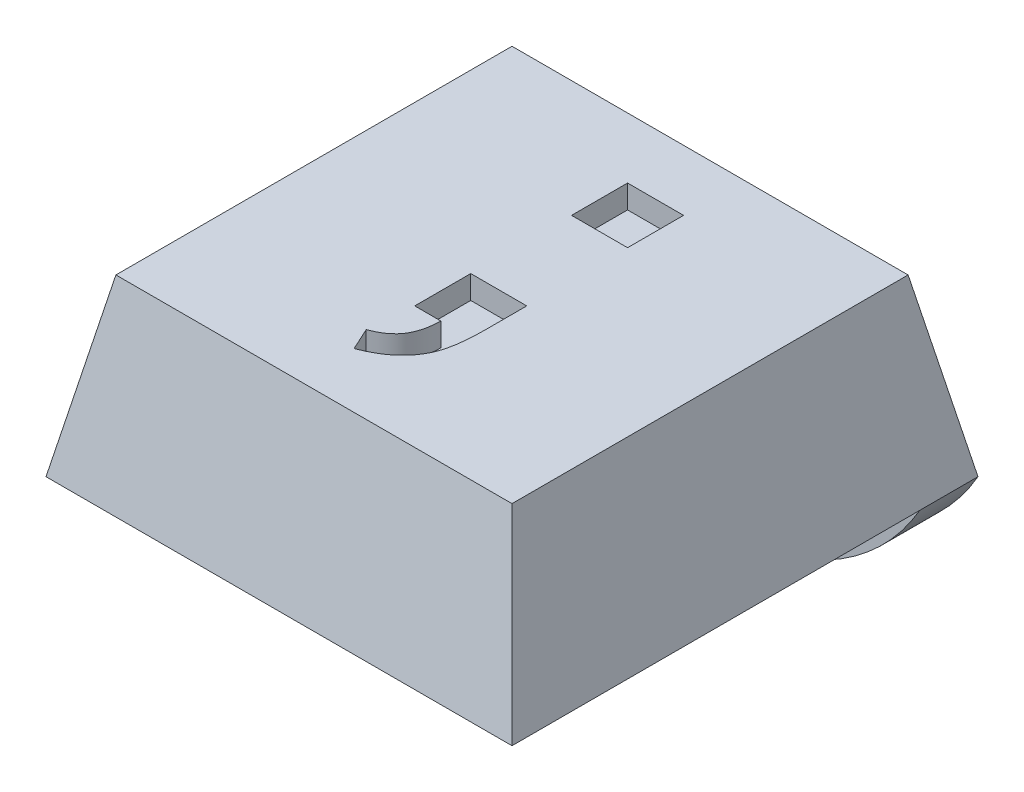
ISO-10303-21;
HEADER;
FILE_DESCRIPTION(('STEP AP214'),'2;1');
FILE_NAME('part.step','',(''),(''),'','','');
FILE_SCHEMA(('AUTOMOTIVE_DESIGN { 1 0 10303 214 1 1 1 1 }'));
ENDSEC;
DATA;
#1=APPLICATION_CONTEXT('core data for automotive mechanical design processes');
#2=APPLICATION_PROTOCOL_DEFINITION('international standard','automotive_design',2000,#1);
#3=PRODUCT_CONTEXT('',#1,'mechanical');
#4=PRODUCT('Part','Part','',(#3));
#5=PRODUCT_RELATED_PRODUCT_CATEGORY('part','',(#4));
#6=PRODUCT_DEFINITION_FORMATION('','',#4);
#7=PRODUCT_DEFINITION_CONTEXT('part definition',#1,'design');
#8=PRODUCT_DEFINITION('design','',#6,#7);
#9=PRODUCT_DEFINITION_SHAPE('','',#8);
#10=(LENGTH_UNIT() NAMED_UNIT(*) SI_UNIT(.MILLI.,.METRE.));
#11=(NAMED_UNIT(*) PLANE_ANGLE_UNIT() SI_UNIT($,.RADIAN.));
#12=(NAMED_UNIT(*) SI_UNIT($,.STERADIAN.) SOLID_ANGLE_UNIT());
#13=UNCERTAINTY_MEASURE_WITH_UNIT(LENGTH_MEASURE(1.E-05),#10,'distance_accuracy_value','');
#14=(GEOMETRIC_REPRESENTATION_CONTEXT(3) GLOBAL_UNCERTAINTY_ASSIGNED_CONTEXT((#13)) GLOBAL_UNIT_ASSIGNED_CONTEXT((#10,
#11,#12)) REPRESENTATION_CONTEXT('',''));
#15=CARTESIAN_POINT('',(0.,0.,0.));
#16=DIRECTION('',(0.,0.,1.));
#17=DIRECTION('',(1.,0.,0.));
#18=AXIS2_PLACEMENT_3D('',#15,#16,#17);
#19=CARTESIAN_POINT('',(0.,3.,0.));
#20=DIRECTION('',(0.,-1.,0.));
#21=DIRECTION('',(0.,0.,-1.));
#22=AXIS2_PLACEMENT_3D('',#19,#20,#21);
#23=PLANE('',#22);
#24=DIRECTION('',(0.,0.,-1.));
#25=VECTOR('',#24,1.);
#26=CARTESIAN_POINT('',(3.62560596272532,3.,-2.70454580911656));
#27=LINE('',#26,#25);
#28=CARTESIAN_POINT('',(3.62560596272532,3.,-2.70454580911656));
#29=VERTEX_POINT('',#28);
#30=CARTESIAN_POINT('',(3.62560596272532,3.,-3.66608427065502));
#31=VERTEX_POINT('',#30);
#32=EDGE_CURVE('E66',#29,#31,#27,.T.);
#33=ORIENTED_EDGE('',*,*,#32,.T.);
#34=DIRECTION('',(1.,0.,0.));
#35=VECTOR('',#34,1.);
#36=CARTESIAN_POINT('',(3.62560596272532,3.,-3.66608427065502));
#37=LINE('',#36,#35);
#38=CARTESIAN_POINT('',(4.58714442426378,3.,-3.66608427065502));
#39=VERTEX_POINT('',#38);
#40=EDGE_CURVE('E257',#31,#39,#37,.T.);
#41=ORIENTED_EDGE('',*,*,#40,.T.);
#42=DIRECTION('',(0.,0.,1.));
#43=VECTOR('',#42,1.);
#44=CARTESIAN_POINT('',(4.58714442426378,3.,-3.66608427065502));
#45=LINE('',#44,#43);
#46=CARTESIAN_POINT('',(4.58714442426378,3.,-2.96696568091143));
#47=VERTEX_POINT('',#46);
#48=EDGE_CURVE('E250',#39,#47,#45,.T.);
#49=ORIENTED_EDGE('',*,*,#48,.T.);
#50=CARTESIAN_POINT('',(4.58714442426378,3.,-2.96696568091143));
#51=CARTESIAN_POINT('',(4.58670080188822,3.,-2.8998214545401));
#52=CARTESIAN_POINT('',(4.58586318464706,3.,-2.773044346911));
#53=CARTESIAN_POINT('',(4.5711807141441,3.,-2.59420782113115));
#54=CARTESIAN_POINT('',(4.55077955569935,3.,-2.43715871833273));
#55=CARTESIAN_POINT('',(4.51832434165699,3.,-2.29987836082914));
#56=CARTESIAN_POINT('',(4.47486996985113,3.,-2.17590282720244));
#57=CARTESIAN_POINT('',(4.41343250196285,3.,-2.0624610132431));
#58=CARTESIAN_POINT('',(4.33787617270612,3.,-1.95390116465176));
#59=CARTESIAN_POINT('',(4.24545832633569,3.,-1.85350819015156));
#60=CARTESIAN_POINT('',(4.13914433473163,3.,-1.76065477060563));
#61=CARTESIAN_POINT('',(4.01770228425887,3.,-1.67990868813372));
#62=CARTESIAN_POINT('',(3.8840141798944,3.,-1.60796791501552));
#63=CARTESIAN_POINT('',(3.78796965576735,3.,-1.57009411793428));
#64=CARTESIAN_POINT('',(3.73878705246891,3.,-1.5506996552704));
#65=B_SPLINE_CURVE_WITH_KNOTS('',3,(#50,#51,#52,#53,#54,#55,#56,#57,#58,#59,#60,#61,#62,#63,
#64),.UNSPECIFIED.,.F.,.F.,(4,1,1,1,1,1,1,1,1,1,1,1,4),(0.,0.11226306929848,0.211967401940366,
0.29994169044828,0.376872974033872,0.447529216959618,0.518973247744178,0.591939579442453,
0.668229800220916,0.746606683184937,0.827453118097728,0.911641971053369,1.),.UNSPECIFIED.);
#66=CARTESIAN_POINT('',(3.73878705246891,3.,-1.5506996552704));
#67=VERTEX_POINT('',#66);
#68=EDGE_CURVE('E244',#47,#67,#65,.T.);
#69=ORIENTED_EDGE('',*,*,#68,.T.);
#70=DIRECTION('',(-0.418608195745655,0.,-0.908166933143113));
#71=VECTOR('',#70,1.);
#72=CARTESIAN_POINT('',(3.73878705246891,3.,-1.5506996552704));
#73=LINE('',#72,#71);
#74=CARTESIAN_POINT('',(3.56150339862276,3.,-1.93531503988579));
#75=VERTEX_POINT('',#74);
#76=EDGE_CURVE('E237',#67,#75,#73,.T.);
#77=ORIENTED_EDGE('',*,*,#76,.T.);
#78=CARTESIAN_POINT('',(3.56150339862276,3.,-1.93531503988579));
#79=CARTESIAN_POINT('',(3.60443904727415,3.,-1.95287327859119));
#80=CARTESIAN_POINT('',(3.68652767187352,3.,-1.98644285797304));
#81=CARTESIAN_POINT('',(3.79593869083479,3.,-2.05254331387848));
#82=CARTESIAN_POINT('',(3.88510542084114,3.,-2.12979243913342));
#83=CARTESIAN_POINT('',(3.95578080095513,3.,-2.21816567640612));
#84=CARTESIAN_POINT('',(4.00665680397726,3.,-2.32038588001785));
#85=CARTESIAN_POINT('',(4.0454560874376,3.,-2.4351046568917));
#86=CARTESIAN_POINT('',(4.06746970030978,3.,-2.56519407020958));
#87=CARTESIAN_POINT('',(4.07197181972445,3.,-2.65672585366105));
#88=CARTESIAN_POINT('',(4.07432391144327,3.,-2.70454580911656));
#89=B_SPLINE_CURVE_WITH_KNOTS('',3,(#78,#79,#80,#81,#82,#83,#84,#85,#86,#87,#88),.UNSPECIFIED.,
.F.,.F.,(4,1,1,1,1,1,1,1,4),(0.,0.139427091721974,0.266570520088693,0.382614322525073,
0.49274666985973,0.604615352902253,0.724373630152636,0.856001486790094,1.),.UNSPECIFIED.);
#90=CARTESIAN_POINT('',(4.07432391144327,3.,-2.70454580911656));
#91=VERTEX_POINT('',#90);
#92=EDGE_CURVE('E230',#75,#91,#89,.T.);
#93=ORIENTED_EDGE('',*,*,#92,.T.);
#94=DIRECTION('',(-1.,0.,0.));
#95=VECTOR('',#94,1.);
#96=CARTESIAN_POINT('',(4.07432391144327,3.,-2.70454580911656));
#97=LINE('',#96,#95);
#98=EDGE_CURVE('E226',#91,#29,#97,.T.);
#99=ORIENTED_EDGE('',*,*,#98,.T.);
#100=EDGE_LOOP('',(#33,#41,#49,#69,#77,#93,#99));
#101=FACE_BOUND('',#100,.T.);
#102=DIRECTION('',(-1.,0.,0.));
#103=VECTOR('',#102,1.);
#104=CARTESIAN_POINT('',(11.,3.,-0.6));
#105=LINE('',#104,#103);
#106=CARTESIAN_POINT('',(7.4,3.,-0.6));
#107=VERTEX_POINT('',#106);
#108=CARTESIAN_POINT('',(0.6,3.,-0.6));
#109=VERTEX_POINT('',#108);
#110=EDGE_CURVE('E377',#107,#109,#105,.T.);
#111=ORIENTED_EDGE('',*,*,#110,.F.);
#112=DIRECTION('',(0.,0.,1.));
#113=VECTOR('',#112,1.);
#114=CARTESIAN_POINT('',(7.4,3.,-8.));
#115=LINE('',#114,#113);
#116=CARTESIAN_POINT('',(7.4,3.,-7.4));
#117=VERTEX_POINT('',#116);
#118=EDGE_CURVE('E390',#117,#107,#115,.T.);
#119=ORIENTED_EDGE('',*,*,#118,.F.);
#120=DIRECTION('',(-1.,0.,0.));
#121=VECTOR('',#120,1.);
#122=CARTESIAN_POINT('',(11.,3.,-7.4));
#123=LINE('',#122,#121);
#124=CARTESIAN_POINT('',(0.599999999999999,3.,-7.4));
#125=VERTEX_POINT('',#124);
#126=EDGE_CURVE('E373',#117,#125,#123,.T.);
#127=ORIENTED_EDGE('',*,*,#126,.T.);
#128=DIRECTION('',(0.,0.,1.));
#129=VECTOR('',#128,1.);
#130=CARTESIAN_POINT('',(0.6,3.,-8.));
#131=LINE('',#130,#129);
#132=EDGE_CURVE('E393',#125,#109,#131,.T.);
#133=ORIENTED_EDGE('',*,*,#132,.T.);
#134=EDGE_LOOP('',(#111,#119,#127,#133));
#135=FACE_BOUND('',#134,.T.);
#136=DIRECTION('',(-1.,0.,0.));
#137=VECTOR('',#136,1.);
#138=CARTESIAN_POINT('',(4.58714442426378,3.,-5.39685350142425));
#139=LINE('',#138,#137);
#140=CARTESIAN_POINT('',(4.58714442426378,3.,-5.39685350142425));
#141=VERTEX_POINT('',#140);
#142=CARTESIAN_POINT('',(3.62560596272532,3.,-5.39685350142425));
#143=VERTEX_POINT('',#142);
#144=EDGE_CURVE('E58',#141,#143,#139,.T.);
#145=ORIENTED_EDGE('',*,*,#144,.T.);
#146=DIRECTION('',(0.,0.,-1.));
#147=VECTOR('',#146,1.);
#148=CARTESIAN_POINT('',(3.62560596272532,3.,-5.39685350142425));
#149=LINE('',#148,#147);
#150=CARTESIAN_POINT('',(3.62560596272532,3.,-6.35839196296271));
#151=VERTEX_POINT('',#150);
#152=EDGE_CURVE('E190',#143,#151,#149,.T.);
#153=ORIENTED_EDGE('',*,*,#152,.T.);
#154=DIRECTION('',(1.,0.,0.));
#155=VECTOR('',#154,1.);
#156=CARTESIAN_POINT('',(3.62560596272532,3.,-6.35839196296271));
#157=LINE('',#156,#155);
#158=CARTESIAN_POINT('',(4.58714442426378,3.,-6.35839196296271));
#159=VERTEX_POINT('',#158);
#160=EDGE_CURVE('E462',#151,#159,#157,.T.);
#161=ORIENTED_EDGE('',*,*,#160,.T.);
#162=DIRECTION('',(0.,0.,1.));
#163=VECTOR('',#162,1.);
#164=CARTESIAN_POINT('',(4.58714442426378,3.,-6.35839196296271));
#165=LINE('',#164,#163);
#166=EDGE_CURVE('E186',#159,#141,#165,.T.);
#167=ORIENTED_EDGE('',*,*,#166,.T.);
#168=EDGE_LOOP('',(#145,#153,#161,#167));
#169=FACE_BOUND('',#168,.T.);
#170=ADVANCED_FACE('F42',(#101,#135,#169),#23,.F.);
#171=CARTESIAN_POINT('',(8.,0.,-8.));
#172=DIRECTION('',(-0.98058067569092,-0.196116135138184,0.));
#173=DIRECTION('',(0.196116135138184,-0.98058067569092,0.));
#174=AXIS2_PLACEMENT_3D('',#171,#172,#173);
#175=PLANE('',#174);
#176=DIRECTION('',(-0.192450089729875,0.962250448649376,-0.192450089729875));
#177=VECTOR('',#176,1.);
#178=CARTESIAN_POINT('',(7.7037037037037,1.48148148148148,-0.296296296296296));
#179=LINE('',#178,#177);
#180=CARTESIAN_POINT('',(8.,0.,0.));
#181=VERTEX_POINT('',#180);
#182=EDGE_CURVE('E387',#181,#107,#179,.T.);
#183=ORIENTED_EDGE('',*,*,#182,.F.);
#184=DIRECTION('',(0.,0.,-1.));
#185=VECTOR('',#184,1.);
#186=CARTESIAN_POINT('',(8.,0.,0.));
#187=LINE('',#186,#185);
#188=CARTESIAN_POINT('',(8.,0.,-7.));
#189=VERTEX_POINT('',#188);
#190=EDGE_CURVE('E404',#181,#189,#187,.T.);
#191=ORIENTED_EDGE('',*,*,#190,.T.);
#192=DIRECTION('',(0.,0.,1.));
#193=VECTOR('',#192,1.);
#194=CARTESIAN_POINT('',(8.,0.,-8.));
#195=LINE('',#194,#193);
#196=CARTESIAN_POINT('',(8.,0.,-8.));
#197=VERTEX_POINT('',#196);
#198=EDGE_CURVE('E192',#197,#189,#195,.T.);
#199=ORIENTED_EDGE('',*,*,#198,.F.);
#200=DIRECTION('',(0.192450089729875,-0.962250448649376,-0.192450089729875));
#201=VECTOR('',#200,1.);
#202=CARTESIAN_POINT('',(8.,0.,-8.));
#203=LINE('',#202,#201);
#204=EDGE_CURVE('E380',#117,#197,#203,.T.);
#205=ORIENTED_EDGE('',*,*,#204,.F.);
#206=ORIENTED_EDGE('',*,*,#118,.T.);
#207=EDGE_LOOP('',(#183,#191,#199,#205,#206));
#208=FACE_BOUND('',#207,.T.);
#209=ADVANCED_FACE('F325',(#208),#175,.F.);
#210=CARTESIAN_POINT('',(0.,0.,-8.));
#211=DIRECTION('',(0.98058067569092,-0.196116135138184,0.));
#212=DIRECTION('',(0.196116135138184,0.98058067569092,0.));
#213=AXIS2_PLACEMENT_3D('',#210,#211,#212);
#214=PLANE('',#213);
#215=DIRECTION('',(-0.192450089729875,-0.962250448649376,0.192450089729875));
#216=VECTOR('',#215,1.);
#217=CARTESIAN_POINT('',(0.296296296296296,1.48148148148148,-0.296296296296296));
#218=LINE('',#217,#216);
#219=CARTESIAN_POINT('',(0.,0.,0.));
#220=VERTEX_POINT('',#219);
#221=EDGE_CURVE('E429',#109,#220,#218,.T.);
#222=ORIENTED_EDGE('',*,*,#221,.F.);
#223=ORIENTED_EDGE('',*,*,#132,.F.);
#224=DIRECTION('',(0.192450089729875,0.962250448649376,0.192450089729875));
#225=VECTOR('',#224,1.);
#226=CARTESIAN_POINT('',(0.,0.,-8.));
#227=LINE('',#226,#225);
#228=CARTESIAN_POINT('',(0.,0.,-8.));
#229=VERTEX_POINT('',#228);
#230=EDGE_CURVE('E403',#229,#125,#227,.T.);
#231=ORIENTED_EDGE('',*,*,#230,.F.);
#232=DIRECTION('',(0.,0.,1.));
#233=VECTOR('',#232,1.);
#234=CARTESIAN_POINT('',(0.,0.,0.));
#235=LINE('',#234,#233);
#236=CARTESIAN_POINT('',(0.,0.,-7.));
#237=VERTEX_POINT('',#236);
#238=EDGE_CURVE('E408',#229,#237,#235,.T.);
#239=ORIENTED_EDGE('',*,*,#238,.T.);
#240=EDGE_CURVE('E397',#237,#220,#235,.T.);
#241=ORIENTED_EDGE('',*,*,#240,.T.);
#242=EDGE_LOOP('',(#222,#223,#231,#239,#241));
#243=FACE_BOUND('',#242,.T.);
#244=ADVANCED_FACE('F322',(#243),#214,.F.);
#245=CARTESIAN_POINT('',(0.,0.,0.));
#246=DIRECTION('',(0.,-1.,0.));
#247=DIRECTION('',(0.,0.,-1.));
#248=AXIS2_PLACEMENT_3D('',#245,#246,#247);
#249=PLANE('',#248);
#250=DIRECTION('',(-1.,0.,0.));
#251=VECTOR('',#250,1.);
#252=CARTESIAN_POINT('',(0.,0.,-7.));
#253=LINE('',#252,#251);
#254=EDGE_CURVE('E198',#189,#237,#253,.T.);
#255=ORIENTED_EDGE('',*,*,#254,.F.);
#256=ORIENTED_EDGE('',*,*,#190,.F.);
#257=DIRECTION('',(1.,0.,0.));
#258=VECTOR('',#257,1.);
#259=CARTESIAN_POINT('',(0.,0.,0.));
#260=LINE('',#259,#258);
#261=EDGE_CURVE('E405',#220,#181,#260,.T.);
#262=ORIENTED_EDGE('',*,*,#261,.F.);
#263=ORIENTED_EDGE('',*,*,#240,.F.);
#264=EDGE_LOOP('',(#255,#256,#262,#263));
#265=FACE_BOUND('',#264,.T.);
#266=CARTESIAN_POINT('',(4.,0.,-3.75));
#267=DIRECTION('',(0.,-1.,0.));
#268=DIRECTION('',(0.,0.,-1.));
#269=AXIS2_PLACEMENT_3D('',#266,#267,#268);
#270=CIRCLE('',#269,1.8);
#271=CARTESIAN_POINT('',(4.,0.,-5.55));
#272=VERTEX_POINT('',#271);
#273=EDGE_CURVE('E362',#272,#272,#270,.T.);
#274=ORIENTED_EDGE('',*,*,#273,.F.);
#275=EDGE_LOOP('',(#274));
#276=FACE_BOUND('',#275,.T.);
#277=ADVANCED_FACE('F320',(#265,#276),#249,.T.);
#278=CARTESIAN_POINT('',(11.,3.,-7.4));
#279=DIRECTION('',(0.,0.196116135138184,-0.98058067569092));
#280=DIRECTION('',(0.,0.98058067569092,0.196116135138184));
#281=AXIS2_PLACEMENT_3D('',#278,#279,#280);
#282=PLANE('',#281);
#283=ORIENTED_EDGE('',*,*,#204,.T.);
#284=DIRECTION('',(-1.,0.,0.));
#285=VECTOR('',#284,1.);
#286=CARTESIAN_POINT('',(0.,0.,-8.));
#287=LINE('',#286,#285);
#288=EDGE_CURVE('E351',#197,#229,#287,.T.);
#289=ORIENTED_EDGE('',*,*,#288,.T.);
#290=ORIENTED_EDGE('',*,*,#230,.T.);
#291=ORIENTED_EDGE('',*,*,#126,.F.);
#292=EDGE_LOOP('',(#283,#289,#290,#291));
#293=FACE_BOUND('',#292,.T.);
#294=ADVANCED_FACE('F316',(#293),#282,.T.);
#295=CARTESIAN_POINT('',(11.,0.,0.));
#296=DIRECTION('',(0.,0.196116135138184,0.98058067569092));
#297=DIRECTION('',(0.,-0.98058067569092,0.196116135138184));
#298=AXIS2_PLACEMENT_3D('',#295,#296,#297);
#299=PLANE('',#298);
#300=ORIENTED_EDGE('',*,*,#182,.T.);
#301=ORIENTED_EDGE('',*,*,#110,.T.);
#302=ORIENTED_EDGE('',*,*,#221,.T.);
#303=ORIENTED_EDGE('',*,*,#261,.T.);
#304=EDGE_LOOP('',(#300,#301,#302,#303));
#305=FACE_BOUND('',#304,.T.);
#306=ADVANCED_FACE('F312',(#305),#299,.T.);
#307=CARTESIAN_POINT('',(4.,0.8,-3.75));
#308=DIRECTION('',(0.,-1.,0.));
#309=DIRECTION('',(0.,0.,-1.));
#310=AXIS2_PLACEMENT_3D('',#307,#308,#309);
#311=CYLINDRICAL_SURFACE('',#310,1.8);
#312=CARTESIAN_POINT('',(4.,0.8,-3.75));
#313=DIRECTION('',(0.,-1.,0.));
#314=DIRECTION('',(0.,0.,-1.));
#315=AXIS2_PLACEMENT_3D('',#312,#313,#314);
#316=CIRCLE('',#315,1.8);
#317=CARTESIAN_POINT('',(4.,0.8,-5.55));
#318=VERTEX_POINT('',#317);
#319=EDGE_CURVE('E369',#318,#318,#316,.T.);
#320=ORIENTED_EDGE('',*,*,#319,.F.);
#321=EDGE_LOOP('',(#320));
#322=FACE_BOUND('',#321,.T.);
#323=ORIENTED_EDGE('',*,*,#273,.T.);
#324=EDGE_LOOP('',(#323));
#325=FACE_BOUND('',#324,.T.);
#326=ADVANCED_FACE('F308',(#322,#325),#311,.F.);
#327=CARTESIAN_POINT('',(4.,0.8,-3.75));
#328=DIRECTION('',(0.,-1.,0.));
#329=DIRECTION('',(0.,0.,-1.));
#330=AXIS2_PLACEMENT_3D('',#327,#328,#329);
#331=PLANE('',#330);
#332=ORIENTED_EDGE('',*,*,#319,.T.);
#333=EDGE_LOOP('',(#332));
#334=FACE_BOUND('',#333,.T.);
#335=ADVANCED_FACE('F304',(#334),#331,.T.);
#336=CARTESIAN_POINT('',(0.,-2.,-8.));
#337=DIRECTION('',(0.,0.,1.));
#338=DIRECTION('',(1.,0.,0.));
#339=AXIS2_PLACEMENT_3D('',#336,#337,#338);
#340=PLANE('',#339);
#341=ORIENTED_EDGE('',*,*,#288,.F.);
#342=CARTESIAN_POINT('',(4.53589838486225,2.,-8.));
#343=DIRECTION('',(0.,0.,1.));
#344=DIRECTION('',(1.,0.,0.));
#345=AXIS2_PLACEMENT_3D('',#342,#343,#344);
#346=CIRCLE('',#345,4.);
#347=CARTESIAN_POINT('',(4.53589838486225,-2.,-8.));
#348=VERTEX_POINT('',#347);
#349=EDGE_CURVE('E11',#197,#348,#346,.F.);
#350=ORIENTED_EDGE('',*,*,#349,.T.);
#351=DIRECTION('',(1.,0.,0.));
#352=VECTOR('',#351,1.);
#353=CARTESIAN_POINT('',(0.,-2.,-8.));
#354=LINE('',#353,#352);
#355=CARTESIAN_POINT('',(3.46410161513775,-2.,-8.));
#356=VERTEX_POINT('',#355);
#357=EDGE_CURVE('E349',#356,#348,#354,.T.);
#358=ORIENTED_EDGE('',*,*,#357,.F.);
#359=CARTESIAN_POINT('',(3.46410161513775,2.,-8.));
#360=DIRECTION('',(0.,0.,1.));
#361=DIRECTION('',(1.,0.,0.));
#362=AXIS2_PLACEMENT_3D('',#359,#360,#361);
#363=CIRCLE('',#362,4.);
#364=EDGE_CURVE('E51',#356,#229,#363,.F.);
#365=ORIENTED_EDGE('',*,*,#364,.T.);
#366=EDGE_LOOP('',(#341,#350,#358,#365));
#367=FACE_BOUND('',#366,.T.);
#368=ADVANCED_FACE('F300',(#367),#340,.F.);
#369=CARTESIAN_POINT('',(0.,-2.,-7.));
#370=DIRECTION('',(0.,0.,-1.));
#371=DIRECTION('',(-1.,0.,0.));
#372=AXIS2_PLACEMENT_3D('',#369,#370,#371);
#373=PLANE('',#372);
#374=DIRECTION('',(-1.,0.,0.));
#375=VECTOR('',#374,1.);
#376=CARTESIAN_POINT('',(0.,-2.,-7.));
#377=LINE('',#376,#375);
#378=CARTESIAN_POINT('',(4.53589838486225,-2.,-7.));
#379=VERTEX_POINT('',#378);
#380=CARTESIAN_POINT('',(3.46410161513775,-2.,-7.));
#381=VERTEX_POINT('',#380);
#382=EDGE_CURVE('E358',#379,#381,#377,.T.);
#383=ORIENTED_EDGE('',*,*,#382,.F.);
#384=CARTESIAN_POINT('',(4.53589838486225,2.,-7.));
#385=DIRECTION('',(0.,0.,-1.));
#386=DIRECTION('',(-1.,0.,0.));
#387=AXIS2_PLACEMENT_3D('',#384,#385,#386);
#388=CIRCLE('',#387,4.);
#389=EDGE_CURVE('E435',#379,#189,#388,.F.);
#390=ORIENTED_EDGE('',*,*,#389,.T.);
#391=ORIENTED_EDGE('',*,*,#254,.T.);
#392=CARTESIAN_POINT('',(3.46410161513775,2.,-7.));
#393=DIRECTION('',(0.,0.,-1.));
#394=DIRECTION('',(-1.,0.,0.));
#395=AXIS2_PLACEMENT_3D('',#392,#393,#394);
#396=CIRCLE('',#395,4.);
#397=EDGE_CURVE('E432',#237,#381,#396,.F.);
#398=ORIENTED_EDGE('',*,*,#397,.T.);
#399=EDGE_LOOP('',(#383,#390,#391,#398));
#400=FACE_BOUND('',#399,.T.);
#401=ADVANCED_FACE('F296',(#400),#373,.F.);
#402=CARTESIAN_POINT('',(0.,-2.,0.));
#403=DIRECTION('',(0.,1.,0.));
#404=DIRECTION('',(0.,0.,1.));
#405=AXIS2_PLACEMENT_3D('',#402,#403,#404);
#406=PLANE('',#405);
#407=ORIENTED_EDGE('',*,*,#357,.T.);
#408=DIRECTION('',(0.,0.,1.));
#409=VECTOR('',#408,1.);
#410=CARTESIAN_POINT('',(4.53589838486225,-2.,0.));
#411=LINE('',#410,#409);
#412=EDGE_CURVE('E345',#348,#379,#411,.T.);
#413=ORIENTED_EDGE('',*,*,#412,.T.);
#414=ORIENTED_EDGE('',*,*,#382,.T.);
#415=DIRECTION('',(0.,0.,-1.));
#416=VECTOR('',#415,1.);
#417=CARTESIAN_POINT('',(3.46410161513775,-2.,0.));
#418=LINE('',#417,#416);
#419=EDGE_CURVE('E356',#381,#356,#418,.T.);
#420=ORIENTED_EDGE('',*,*,#419,.T.);
#421=EDGE_LOOP('',(#407,#413,#414,#420));
#422=FACE_BOUND('',#421,.T.);
#423=ADVANCED_FACE('F292',(#422),#406,.F.);
#424=CARTESIAN_POINT('',(4.53589838486225,2.,-8.));
#425=DIRECTION('',(0.,0.,1.));
#426=DIRECTION('',(1.,0.,0.));
#427=AXIS2_PLACEMENT_3D('',#424,#425,#426);
#428=CYLINDRICAL_SURFACE('',#427,4.);
#429=ORIENTED_EDGE('',*,*,#349,.F.);
#430=ORIENTED_EDGE('',*,*,#198,.T.);
#431=ORIENTED_EDGE('',*,*,#389,.F.);
#432=ORIENTED_EDGE('',*,*,#412,.F.);
#433=EDGE_LOOP('',(#429,#430,#431,#432));
#434=FACE_BOUND('',#433,.T.);
#435=ADVANCED_FACE('F295',(#434),#428,.T.);
#436=CARTESIAN_POINT('',(3.46410161513775,2.,-8.));
#437=DIRECTION('',(0.,0.,-1.));
#438=DIRECTION('',(-1.,0.,0.));
#439=AXIS2_PLACEMENT_3D('',#436,#437,#438);
#440=CYLINDRICAL_SURFACE('',#439,4.);
#441=ORIENTED_EDGE('',*,*,#397,.F.);
#442=ORIENTED_EDGE('',*,*,#238,.F.);
#443=ORIENTED_EDGE('',*,*,#364,.F.);
#444=ORIENTED_EDGE('',*,*,#419,.F.);
#445=EDGE_LOOP('',(#441,#442,#443,#444));
#446=FACE_BOUND('',#445,.T.);
#447=ADVANCED_FACE('F44',(#446),#440,.T.);
#448=CARTESIAN_POINT('',(3.62560596272532,2.6,-2.70454580911656));
#449=DIRECTION('',(1.,0.,0.));
#450=DIRECTION('',(0.,0.,-1.));
#451=AXIS2_PLACEMENT_3D('',#448,#449,#450);
#452=PLANE('',#451);
#453=ORIENTED_EDGE('',*,*,#32,.F.);
#454=DIRECTION('',(0.,1.,0.));
#455=VECTOR('',#454,1.);
#456=CARTESIAN_POINT('',(3.62560596272532,2.6,-2.70454580911656));
#457=LINE('',#456,#455);
#458=CARTESIAN_POINT('',(3.62560596272532,2.6,-2.70454580911656));
#459=VERTEX_POINT('',#458);
#460=EDGE_CURVE('E222',#459,#29,#457,.T.);
#461=ORIENTED_EDGE('',*,*,#460,.F.);
#462=DIRECTION('',(0.,0.,-1.));
#463=VECTOR('',#462,1.);
#464=CARTESIAN_POINT('',(3.62560596272532,2.6,-2.70454580911656));
#465=LINE('',#464,#463);
#466=CARTESIAN_POINT('',(3.62560596272532,2.6,-3.66608427065502));
#467=VERTEX_POINT('',#466);
#468=EDGE_CURVE('E231',#459,#467,#465,.T.);
#469=ORIENTED_EDGE('',*,*,#468,.T.);
#470=DIRECTION('',(0.,1.,0.));
#471=VECTOR('',#470,1.);
#472=CARTESIAN_POINT('',(3.62560596272532,2.6,-3.66608427065502));
#473=LINE('',#472,#471);
#474=EDGE_CURVE('E204',#467,#31,#473,.T.);
#475=ORIENTED_EDGE('',*,*,#474,.T.);
#476=EDGE_LOOP('',(#453,#461,#469,#475));
#477=FACE_BOUND('',#476,.T.);
#478=ADVANCED_FACE('F340',(#477),#452,.T.);
#479=CARTESIAN_POINT('',(3.62560596272532,2.6,-3.66608427065502));
#480=DIRECTION('',(0.,0.,1.));
#481=DIRECTION('',(1.,0.,0.));
#482=AXIS2_PLACEMENT_3D('',#479,#480,#481);
#483=PLANE('',#482);
#484=ORIENTED_EDGE('',*,*,#40,.F.);
#485=ORIENTED_EDGE('',*,*,#474,.F.);
#486=DIRECTION('',(1.,0.,0.));
#487=VECTOR('',#486,1.);
#488=CARTESIAN_POINT('',(3.62560596272532,2.6,-3.66608427065502));
#489=LINE('',#488,#487);
#490=CARTESIAN_POINT('',(4.58714442426378,2.6,-3.66608427065502));
#491=VERTEX_POINT('',#490);
#492=EDGE_CURVE('E518',#467,#491,#489,.T.);
#493=ORIENTED_EDGE('',*,*,#492,.T.);
#494=DIRECTION('',(0.,1.,0.));
#495=VECTOR('',#494,1.);
#496=CARTESIAN_POINT('',(4.58714442426378,2.6,-3.66608427065502));
#497=LINE('',#496,#495);
#498=EDGE_CURVE('E207',#491,#39,#497,.T.);
#499=ORIENTED_EDGE('',*,*,#498,.T.);
#500=EDGE_LOOP('',(#484,#485,#493,#499));
#501=FACE_BOUND('',#500,.T.);
#502=ADVANCED_FACE('F497',(#501),#483,.T.);
#503=CARTESIAN_POINT('',(4.58714442426378,2.6,-3.66608427065502));
#504=DIRECTION('',(-1.,0.,0.));
#505=DIRECTION('',(0.,0.,1.));
#506=AXIS2_PLACEMENT_3D('',#503,#504,#505);
#507=PLANE('',#506);
#508=ORIENTED_EDGE('',*,*,#48,.F.);
#509=ORIENTED_EDGE('',*,*,#498,.F.);
#510=DIRECTION('',(0.,0.,1.));
#511=VECTOR('',#510,1.);
#512=CARTESIAN_POINT('',(4.58714442426378,2.6,-3.66608427065502));
#513=LINE('',#512,#511);
#514=CARTESIAN_POINT('',(4.58714442426378,2.6,-2.96696568091143));
#515=VERTEX_POINT('',#514);
#516=EDGE_CURVE('E513',#491,#515,#513,.T.);
#517=ORIENTED_EDGE('',*,*,#516,.T.);
#518=DIRECTION('',(0.,1.,0.));
#519=VECTOR('',#518,1.);
#520=CARTESIAN_POINT('',(4.58714442426378,2.6,-2.96696568091143));
#521=LINE('',#520,#519);
#522=EDGE_CURVE('E210',#515,#47,#521,.T.);
#523=ORIENTED_EDGE('',*,*,#522,.T.);
#524=EDGE_LOOP('',(#508,#509,#517,#523));
#525=FACE_BOUND('',#524,.T.);
#526=ADVANCED_FACE('F500',(#525),#507,.T.);
#527=CARTESIAN_POINT('',(4.58714442426378,2.6,-2.96696568091143));
#528=CARTESIAN_POINT('',(4.58670080188822,2.6,-2.8998214545401));
#529=CARTESIAN_POINT('',(4.58586318464706,2.6,-2.773044346911));
#530=CARTESIAN_POINT('',(4.5711807141441,2.6,-2.59420782113115));
#531=CARTESIAN_POINT('',(4.55077955569935,2.6,-2.43715871833273));
#532=CARTESIAN_POINT('',(4.51832434165699,2.6,-2.29987836082914));
#533=CARTESIAN_POINT('',(4.47486996985113,2.6,-2.17590282720244));
#534=CARTESIAN_POINT('',(4.41343250196285,2.6,-2.0624610132431));
#535=CARTESIAN_POINT('',(4.33787617270612,2.6,-1.95390116465176));
#536=CARTESIAN_POINT('',(4.24545832633569,2.6,-1.85350819015156));
#537=CARTESIAN_POINT('',(4.13914433473163,2.6,-1.76065477060563));
#538=CARTESIAN_POINT('',(4.01770228425887,2.6,-1.67990868813372));
#539=CARTESIAN_POINT('',(3.8840141798944,2.6,-1.60796791501552));
#540=CARTESIAN_POINT('',(3.78796965576735,2.6,-1.57009411793428));
#541=CARTESIAN_POINT('',(3.73878705246891,2.6,-1.5506996552704));
#542=B_SPLINE_CURVE_WITH_KNOTS('',3,(#527,#528,#529,#530,#531,#532,#533,#534,#535,#536,#537,
#538,#539,#540,#541),.UNSPECIFIED.,.F.,.F.,(4,1,1,1,1,1,1,1,1,1,1,1,4),(0.,0.11226306929848,
0.211967401940366,0.29994169044828,0.376872974033872,0.447529216959618,0.518973247744178,
0.591939579442453,0.668229800220916,0.746606683184937,0.827453118097728,0.911641971053369,1.),.UNSPECIFIED.);
#543=DIRECTION('',(0.,1.,0.));
#544=VECTOR('',#543,1.);
#545=SURFACE_OF_LINEAR_EXTRUSION('',#542,#544);
#546=ORIENTED_EDGE('',*,*,#68,.F.);
#547=ORIENTED_EDGE('',*,*,#522,.F.);
#548=CARTESIAN_POINT('',(3.73878705246891,2.6,-1.5506996552704));
#549=VERTEX_POINT('',#548);
#550=EDGE_CURVE('E507',#515,#549,#542,.T.);
#551=ORIENTED_EDGE('',*,*,#550,.T.);
#552=DIRECTION('',(0.,1.,0.));
#553=VECTOR('',#552,1.);
#554=CARTESIAN_POINT('',(3.73878705246891,2.6,-1.5506996552704));
#555=LINE('',#554,#553);
#556=EDGE_CURVE('E213',#549,#67,#555,.T.);
#557=ORIENTED_EDGE('',*,*,#556,.T.);
#558=EDGE_LOOP('',(#546,#547,#551,#557));
#559=FACE_BOUND('',#558,.T.);
#560=ADVANCED_FACE('F503',(#559),#545,.T.);
#561=CARTESIAN_POINT('',(3.73878705246891,2.6,-1.5506996552704));
#562=DIRECTION('',(0.908166933143113,0.,-0.418608195745655));
#563=DIRECTION('',(-0.418608195745655,0.,-0.908166933143113));
#564=AXIS2_PLACEMENT_3D('',#561,#562,#563);
#565=PLANE('',#564);
#566=ORIENTED_EDGE('',*,*,#76,.F.);
#567=ORIENTED_EDGE('',*,*,#556,.F.);
#568=DIRECTION('',(-0.418608195745655,0.,-0.908166933143113));
#569=VECTOR('',#568,1.);
#570=CARTESIAN_POINT('',(3.73878705246891,2.6,-1.5506996552704));
#571=LINE('',#570,#569);
#572=CARTESIAN_POINT('',(3.56150339862276,2.6,-1.93531503988579));
#573=VERTEX_POINT('',#572);
#574=EDGE_CURVE('E271',#549,#573,#571,.T.);
#575=ORIENTED_EDGE('',*,*,#574,.T.);
#576=DIRECTION('',(0.,1.,0.));
#577=VECTOR('',#576,1.);
#578=CARTESIAN_POINT('',(3.56150339862276,2.6,-1.93531503988579));
#579=LINE('',#578,#577);
#580=EDGE_CURVE('E216',#573,#75,#579,.T.);
#581=ORIENTED_EDGE('',*,*,#580,.T.);
#582=EDGE_LOOP('',(#566,#567,#575,#581));
#583=FACE_BOUND('',#582,.T.);
#584=ADVANCED_FACE('F282',(#583),#565,.T.);
#585=CARTESIAN_POINT('',(3.56150339862276,2.6,-1.93531503988579));
#586=CARTESIAN_POINT('',(3.60443904727415,2.6,-1.95287327859119));
#587=CARTESIAN_POINT('',(3.68652767187352,2.6,-1.98644285797304));
#588=CARTESIAN_POINT('',(3.79593869083479,2.6,-2.05254331387848));
#589=CARTESIAN_POINT('',(3.88510542084114,2.6,-2.12979243913342));
#590=CARTESIAN_POINT('',(3.95578080095513,2.6,-2.21816567640612));
#591=CARTESIAN_POINT('',(4.00665680397726,2.6,-2.32038588001785));
#592=CARTESIAN_POINT('',(4.0454560874376,2.6,-2.4351046568917));
#593=CARTESIAN_POINT('',(4.06746970030978,2.6,-2.56519407020958));
#594=CARTESIAN_POINT('',(4.07197181972445,2.6,-2.65672585366105));
#595=CARTESIAN_POINT('',(4.07432391144327,2.6,-2.70454580911656));
#596=B_SPLINE_CURVE_WITH_KNOTS('',3,(#585,#586,#587,#588,#589,#590,#591,#592,#593,#594,#595),
.UNSPECIFIED.,.F.,.F.,(4,1,1,1,1,1,1,1,4),(0.,0.139427091721974,0.266570520088693,
0.382614322525073,0.49274666985973,0.604615352902253,0.724373630152636,0.856001486790094,1.),.UNSPECIFIED.);
#597=DIRECTION('',(0.,1.,0.));
#598=VECTOR('',#597,1.);
#599=SURFACE_OF_LINEAR_EXTRUSION('',#596,#598);
#600=ORIENTED_EDGE('',*,*,#92,.F.);
#601=ORIENTED_EDGE('',*,*,#580,.F.);
#602=CARTESIAN_POINT('',(4.07432391144327,2.6,-2.70454580911656));
#603=VERTEX_POINT('',#602);
#604=EDGE_CURVE('E265',#573,#603,#596,.T.);
#605=ORIENTED_EDGE('',*,*,#604,.T.);
#606=DIRECTION('',(0.,1.,0.));
#607=VECTOR('',#606,1.);
#608=CARTESIAN_POINT('',(4.07432391144327,2.6,-2.70454580911656));
#609=LINE('',#608,#607);
#610=EDGE_CURVE('E219',#603,#91,#609,.T.);
#611=ORIENTED_EDGE('',*,*,#610,.T.);
#612=EDGE_LOOP('',(#600,#601,#605,#611));
#613=FACE_BOUND('',#612,.T.);
#614=ADVANCED_FACE('F277',(#613),#599,.T.);
#615=CARTESIAN_POINT('',(4.07432391144327,2.6,-2.70454580911656));
#616=DIRECTION('',(0.,0.,-1.));
#617=DIRECTION('',(-1.,0.,0.));
#618=AXIS2_PLACEMENT_3D('',#615,#616,#617);
#619=PLANE('',#618);
#620=ORIENTED_EDGE('',*,*,#98,.F.);
#621=ORIENTED_EDGE('',*,*,#610,.F.);
#622=DIRECTION('',(-1.,0.,0.));
#623=VECTOR('',#622,1.);
#624=CARTESIAN_POINT('',(4.07432391144327,2.6,-2.70454580911656));
#625=LINE('',#624,#623);
#626=EDGE_CURVE('E225',#603,#459,#625,.T.);
#627=ORIENTED_EDGE('',*,*,#626,.T.);
#628=ORIENTED_EDGE('',*,*,#460,.T.);
#629=EDGE_LOOP('',(#620,#621,#627,#628));
#630=FACE_BOUND('',#629,.T.);
#631=ADVANCED_FACE('F281',(#630),#619,.T.);
#632=CARTESIAN_POINT('',(4.42927512303432,2.6,-2.09381180677731));
#633=DIRECTION('',(1.14085817799472E-13,1.,0.));
#634=DIRECTION('',(-1.,1.14085817799472E-13,0.));
#635=AXIS2_PLACEMENT_3D('',#632,#633,#634);
#636=PLANE('',#635);
#637=ORIENTED_EDGE('',*,*,#468,.F.);
#638=ORIENTED_EDGE('',*,*,#626,.F.);
#639=ORIENTED_EDGE('',*,*,#604,.F.);
#640=ORIENTED_EDGE('',*,*,#574,.F.);
#641=ORIENTED_EDGE('',*,*,#550,.F.);
#642=ORIENTED_EDGE('',*,*,#516,.F.);
#643=ORIENTED_EDGE('',*,*,#492,.F.);
#644=EDGE_LOOP('',(#637,#638,#639,#640,#641,#642,#643));
#645=FACE_BOUND('',#644,.T.);
#646=ADVANCED_FACE('F287',(#645),#636,.T.);
#647=CARTESIAN_POINT('',(4.58714442426378,2.6,-5.39685350142425));
#648=DIRECTION('',(0.,0.,-1.));
#649=DIRECTION('',(-1.,0.,0.));
#650=AXIS2_PLACEMENT_3D('',#647,#648,#649);
#651=PLANE('',#650);
#652=ORIENTED_EDGE('',*,*,#144,.F.);
#653=DIRECTION('',(0.,1.,0.));
#654=VECTOR('',#653,1.);
#655=CARTESIAN_POINT('',(4.58714442426378,2.6,-5.39685350142425));
#656=LINE('',#655,#654);
#657=CARTESIAN_POINT('',(4.58714442426378,2.6,-5.39685350142425));
#658=VERTEX_POINT('',#657);
#659=EDGE_CURVE('E184',#658,#141,#656,.T.);
#660=ORIENTED_EDGE('',*,*,#659,.F.);
#661=DIRECTION('',(-1.,0.,0.));
#662=VECTOR('',#661,1.);
#663=CARTESIAN_POINT('',(4.58714442426378,2.6,-5.39685350142425));
#664=LINE('',#663,#662);
#665=CARTESIAN_POINT('',(3.62560596272532,2.6,-5.39685350142425));
#666=VERTEX_POINT('',#665);
#667=EDGE_CURVE('E175',#658,#666,#664,.T.);
#668=ORIENTED_EDGE('',*,*,#667,.T.);
#669=DIRECTION('',(0.,1.,0.));
#670=VECTOR('',#669,1.);
#671=CARTESIAN_POINT('',(3.62560596272532,2.6,-5.39685350142425));
#672=LINE('',#671,#670);
#673=EDGE_CURVE('E183',#666,#143,#672,.T.);
#674=ORIENTED_EDGE('',*,*,#673,.T.);
#675=EDGE_LOOP('',(#652,#660,#668,#674));
#676=FACE_BOUND('',#675,.T.);
#677=ADVANCED_FACE('F182',(#676),#651,.T.);
#678=CARTESIAN_POINT('',(3.62560596272532,2.6,-5.39685350142425));
#679=DIRECTION('',(1.,0.,0.));
#680=DIRECTION('',(0.,0.,-1.));
#681=AXIS2_PLACEMENT_3D('',#678,#679,#680);
#682=PLANE('',#681);
#683=ORIENTED_EDGE('',*,*,#152,.F.);
#684=ORIENTED_EDGE('',*,*,#673,.F.);
#685=DIRECTION('',(0.,0.,-1.));
#686=VECTOR('',#685,1.);
#687=CARTESIAN_POINT('',(3.62560596272532,2.6,-5.39685350142425));
#688=LINE('',#687,#686);
#689=CARTESIAN_POINT('',(3.62560596272532,2.6,-6.35839196296271));
#690=VERTEX_POINT('',#689);
#691=EDGE_CURVE('E171',#666,#690,#688,.T.);
#692=ORIENTED_EDGE('',*,*,#691,.T.);
#693=DIRECTION('',(0.,1.,0.));
#694=VECTOR('',#693,1.);
#695=CARTESIAN_POINT('',(3.62560596272532,2.6,-6.35839196296271));
#696=LINE('',#695,#694);
#697=EDGE_CURVE('E193',#690,#151,#696,.T.);
#698=ORIENTED_EDGE('',*,*,#697,.T.);
#699=EDGE_LOOP('',(#683,#684,#692,#698));
#700=FACE_BOUND('',#699,.T.);
#701=ADVANCED_FACE('F188',(#700),#682,.T.);
#702=CARTESIAN_POINT('',(3.62560596272532,2.6,-6.35839196296271));
#703=DIRECTION('',(0.,0.,1.));
#704=DIRECTION('',(1.,0.,0.));
#705=AXIS2_PLACEMENT_3D('',#702,#703,#704);
#706=PLANE('',#705);
#707=ORIENTED_EDGE('',*,*,#160,.F.);
#708=ORIENTED_EDGE('',*,*,#697,.F.);
#709=DIRECTION('',(1.,0.,0.));
#710=VECTOR('',#709,1.);
#711=CARTESIAN_POINT('',(3.62560596272532,2.6,-6.35839196296271));
#712=LINE('',#711,#710);
#713=CARTESIAN_POINT('',(4.58714442426378,2.6,-6.35839196296271));
#714=VERTEX_POINT('',#713);
#715=EDGE_CURVE('E176',#690,#714,#712,.T.);
#716=ORIENTED_EDGE('',*,*,#715,.T.);
#717=DIRECTION('',(0.,1.,0.));
#718=VECTOR('',#717,1.);
#719=CARTESIAN_POINT('',(4.58714442426378,2.6,-6.35839196296271));
#720=LINE('',#719,#718);
#721=EDGE_CURVE('E200',#714,#159,#720,.T.);
#722=ORIENTED_EDGE('',*,*,#721,.T.);
#723=EDGE_LOOP('',(#707,#708,#716,#722));
#724=FACE_BOUND('',#723,.T.);
#725=ADVANCED_FACE('F477',(#724),#706,.T.);
#726=CARTESIAN_POINT('',(4.58714442426378,2.6,-6.35839196296271));
#727=DIRECTION('',(-1.,0.,0.));
#728=DIRECTION('',(0.,0.,1.));
#729=AXIS2_PLACEMENT_3D('',#726,#727,#728);
#730=PLANE('',#729);
#731=ORIENTED_EDGE('',*,*,#166,.F.);
#732=ORIENTED_EDGE('',*,*,#721,.F.);
#733=DIRECTION('',(0.,0.,1.));
#734=VECTOR('',#733,1.);
#735=CARTESIAN_POINT('',(4.58714442426378,2.6,-6.35839196296271));
#736=LINE('',#735,#734);
#737=EDGE_CURVE('E465',#714,#658,#736,.T.);
#738=ORIENTED_EDGE('',*,*,#737,.T.);
#739=ORIENTED_EDGE('',*,*,#659,.T.);
#740=EDGE_LOOP('',(#731,#732,#738,#739));
#741=FACE_BOUND('',#740,.T.);
#742=ADVANCED_FACE('F479',(#741),#730,.T.);
#743=CARTESIAN_POINT('',(0.,2.6,0.));
#744=DIRECTION('',(0.,-1.,0.));
#745=DIRECTION('',(0.,0.,-1.));
#746=AXIS2_PLACEMENT_3D('',#743,#744,#745);
#747=PLANE('',#746);
#748=ORIENTED_EDGE('',*,*,#667,.F.);
#749=ORIENTED_EDGE('',*,*,#737,.F.);
#750=ORIENTED_EDGE('',*,*,#715,.F.);
#751=ORIENTED_EDGE('',*,*,#691,.F.);
#752=EDGE_LOOP('',(#748,#749,#750,#751));
#753=FACE_BOUND('',#752,.T.);
#754=ADVANCED_FACE('F173',(#753),#747,.F.);
#755=CLOSED_SHELL('',(#170,#209,#244,#277,#294,#306,#326,#335,#368,#401,#423,#435,#447,#478,
#502,#526,#560,#584,#614,#631,#646,#677,#701,#725,#742,#754));
#756=MANIFOLD_SOLID_BREP('B2',#755);
#757=ADVANCED_BREP_SHAPE_REPRESENTATION('',(#18,#756),#14);
#758=SHAPE_DEFINITION_REPRESENTATION(#9,#757);
ENDSEC;
END-ISO-10303-21;
